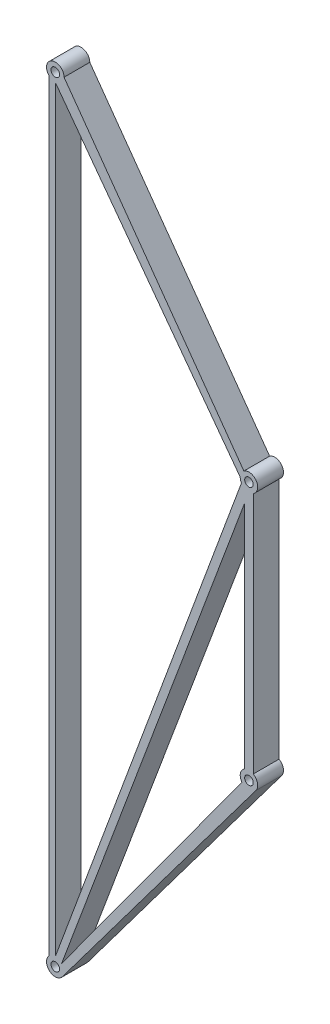
ISO-10303-21;
HEADER;
FILE_DESCRIPTION(('STEP AP214'),'2;1');
FILE_NAME('part.step','',(''),(''),'','','');
FILE_SCHEMA(('AUTOMOTIVE_DESIGN { 1 0 10303 214 1 1 1 1 }'));
ENDSEC;
DATA;
#1=APPLICATION_CONTEXT('core data for automotive mechanical design processes');
#2=APPLICATION_PROTOCOL_DEFINITION('international standard','automotive_design',2000,#1);
#3=PRODUCT_CONTEXT('',#1,'mechanical');
#4=PRODUCT('Part','Part','',(#3));
#5=PRODUCT_RELATED_PRODUCT_CATEGORY('part','',(#4));
#6=PRODUCT_DEFINITION_FORMATION('','',#4);
#7=PRODUCT_DEFINITION_CONTEXT('part definition',#1,'design');
#8=PRODUCT_DEFINITION('design','',#6,#7);
#9=PRODUCT_DEFINITION_SHAPE('','',#8);
#10=(LENGTH_UNIT() NAMED_UNIT(*) SI_UNIT(.MILLI.,.METRE.));
#11=(NAMED_UNIT(*) PLANE_ANGLE_UNIT() SI_UNIT($,.RADIAN.));
#12=(NAMED_UNIT(*) SI_UNIT($,.STERADIAN.) SOLID_ANGLE_UNIT());
#13=UNCERTAINTY_MEASURE_WITH_UNIT(LENGTH_MEASURE(1.E-05),#10,'distance_accuracy_value','');
#14=(GEOMETRIC_REPRESENTATION_CONTEXT(3) GLOBAL_UNCERTAINTY_ASSIGNED_CONTEXT((#13)) GLOBAL_UNIT_ASSIGNED_CONTEXT((#10,
#11,#12)) REPRESENTATION_CONTEXT('',''));
#15=CARTESIAN_POINT('',(0.,0.,0.));
#16=DIRECTION('',(0.,0.,1.));
#17=DIRECTION('',(1.,0.,0.));
#18=AXIS2_PLACEMENT_3D('',#15,#16,#17);
#19=CARTESIAN_POINT('',(0.,400.,39.9));
#20=DIRECTION('',(0.,0.,1.));
#21=DIRECTION('',(1.,0.,0.));
#22=AXIS2_PLACEMENT_3D('',#19,#20,#21);
#23=PLANE('',#22);
#24=CARTESIAN_POINT('',(0.,400.,39.9));
#25=DIRECTION('',(0.,0.,1.));
#26=DIRECTION('',(1.,0.,0.));
#27=AXIS2_PLACEMENT_3D('',#24,#25,#26);
#28=CIRCLE('',#27,6.64999999999998);
#29=CARTESIAN_POINT('',(6.64999999999998,400.,39.9));
#30=VERTEX_POINT('',#29);
#31=EDGE_CURVE('E183',#30,#30,#28,.T.);
#32=ORIENTED_EDGE('',*,*,#31,.F.);
#33=EDGE_LOOP('',(#32));
#34=FACE_BOUND('',#33,.T.);
#35=CARTESIAN_POINT('',(0.,0.,39.9));
#36=DIRECTION('',(0.,0.,1.));
#37=DIRECTION('',(1.,0.,0.));
#38=AXIS2_PLACEMENT_3D('',#35,#36,#37);
#39=CIRCLE('',#38,6.65);
#40=CARTESIAN_POINT('',(6.65,0.,39.9));
#41=VERTEX_POINT('',#40);
#42=EDGE_CURVE('E229',#41,#41,#39,.T.);
#43=ORIENTED_EDGE('',*,*,#42,.F.);
#44=EDGE_LOOP('',(#43));
#45=FACE_BOUND('',#44,.T.);
#46=CARTESIAN_POINT('',(0.,400.,39.9));
#47=DIRECTION('',(0.,0.,1.));
#48=DIRECTION('',(1.,0.,0.));
#49=AXIS2_PLACEMENT_3D('',#46,#47,#48);
#50=CIRCLE('',#49,13.55);
#51=CARTESIAN_POINT('',(6.68007705825914,388.211061519555,39.9));
#52=VERTEX_POINT('',#51);
#53=CARTESIAN_POINT('',(-7.88918874496178,411.01649676378,39.9));
#54=VERTEX_POINT('',#53);
#55=EDGE_CURVE('E237',#52,#54,#50,.T.);
#56=ORIENTED_EDGE('',*,*,#55,.T.);
#57=DIRECTION('',(-0.582227951657693,0.813025591422857,0.));
#58=VECTOR('',#57,1.);
#59=CARTESIAN_POINT('',(-286.45,800.,39.9));
#60=LINE('',#59,#58);
#61=CARTESIAN_POINT('',(-286.45,800.,39.9));
#62=VERTEX_POINT('',#61);
#63=EDGE_CURVE('E236',#54,#62,#60,.T.);
#64=ORIENTED_EDGE('',*,*,#63,.T.);
#65=CARTESIAN_POINT('',(-300.,800.,39.9));
#66=DIRECTION('',(0.,0.,1.));
#67=DIRECTION('',(1.,0.,0.));
#68=AXIS2_PLACEMENT_3D('',#65,#66,#67);
#69=CIRCLE('',#68,13.5500000000001);
#70=CARTESIAN_POINT('',(-309.83738553197,790.681827116039,39.9));
#71=VERTEX_POINT('',#70);
#72=EDGE_CURVE('E242',#62,#71,#69,.T.);
#73=ORIENTED_EDGE('',*,*,#72,.T.);
#74=DIRECTION('',(0.,-1.,0.));
#75=VECTOR('',#74,1.);
#76=CARTESIAN_POINT('',(-309.83738553197,-390.681827116039,39.9));
#77=LINE('',#76,#75);
#78=CARTESIAN_POINT('',(-309.83738553197,-390.681827116039,39.9));
#79=VERTEX_POINT('',#78);
#80=EDGE_CURVE('E243',#71,#79,#77,.T.);
#81=ORIENTED_EDGE('',*,*,#80,.T.);
#82=CARTESIAN_POINT('',(-300.,-400.,39.9));
#83=DIRECTION('',(0.,0.,1.));
#84=DIRECTION('',(1.,0.,0.));
#85=AXIS2_PLACEMENT_3D('',#82,#83,#84);
#86=CIRCLE('',#85,13.55);
#87=CARTESIAN_POINT('',(-289.16,-408.13,39.9));
#88=VERTEX_POINT('',#87);
#89=EDGE_CURVE('E247',#79,#88,#86,.T.);
#90=ORIENTED_EDGE('',*,*,#89,.T.);
#91=DIRECTION('',(0.6,0.8,0.));
#92=VECTOR('',#91,1.);
#93=CARTESIAN_POINT('',(-289.16,-408.13,39.9));
#94=LINE('',#93,#92);
#95=CARTESIAN_POINT('',(10.84,-8.13000000000002,39.9));
#96=VERTEX_POINT('',#95);
#97=EDGE_CURVE('E246',#88,#96,#94,.T.);
#98=ORIENTED_EDGE('',*,*,#97,.T.);
#99=CARTESIAN_POINT('',(0.,0.,39.9));
#100=DIRECTION('',(0.,0.,1.));
#101=DIRECTION('',(1.,0.,0.));
#102=AXIS2_PLACEMENT_3D('',#99,#100,#101);
#103=CIRCLE('',#102,13.55);
#104=CARTESIAN_POINT('',(6.6800770582592,11.7889384804451,39.9));
#105=VERTEX_POINT('',#104);
#106=EDGE_CURVE('E248',#96,#105,#103,.T.);
#107=ORIENTED_EDGE('',*,*,#106,.T.);
#108=DIRECTION('',(0.,1.,0.));
#109=VECTOR('',#108,1.);
#110=CARTESIAN_POINT('',(6.6800770582592,11.7889384804451,39.9));
#111=LINE('',#110,#109);
#112=EDGE_CURVE('E252',#105,#52,#111,.T.);
#113=ORIENTED_EDGE('',*,*,#112,.T.);
#114=EDGE_LOOP('',(#56,#64,#73,#81,#90,#98,#107,#113));
#115=FACE_BOUND('',#114,.T.);
#116=CARTESIAN_POINT('',(-300.,-400.,39.9));
#117=DIRECTION('',(0.,0.,1.));
#118=DIRECTION('',(1.,0.,0.));
#119=AXIS2_PLACEMENT_3D('',#116,#117,#118);
#120=CIRCLE('',#119,6.64999999999998);
#121=CARTESIAN_POINT('',(-293.35,-400.,39.9));
#122=VERTEX_POINT('',#121);
#123=EDGE_CURVE('E222',#122,#122,#120,.T.);
#124=ORIENTED_EDGE('',*,*,#123,.F.);
#125=EDGE_LOOP('',(#124));
#126=FACE_BOUND('',#125,.T.);
#127=DIRECTION('',(-0.349789502371966,-0.936828321535153,0.));
#128=VECTOR('',#127,1.);
#129=CARTESIAN_POINT('',(-290.16261446803,-390.681827116039,39.9));
#130=LINE('',#129,#128);
#131=CARTESIAN_POINT('',(-6.68007705825919,368.558996022529,39.9));
#132=VERTEX_POINT('',#131);
#133=CARTESIAN_POINT('',(-290.16261446803,-390.681827116039,39.9));
#134=VERTEX_POINT('',#133);
#135=EDGE_CURVE('E193',#132,#134,#130,.T.);
#136=ORIENTED_EDGE('',*,*,#135,.F.);
#137=DIRECTION('',(0.,1.,0.));
#138=VECTOR('',#137,1.);
#139=CARTESIAN_POINT('',(-6.6800770582592,11.7889384804451,39.9));
#140=LINE('',#139,#138);
#141=CARTESIAN_POINT('',(-6.68007705825919,11.7889384804451,39.9));
#142=VERTEX_POINT('',#141);
#143=EDGE_CURVE('E194',#142,#132,#140,.T.);
#144=ORIENTED_EDGE('',*,*,#143,.F.);
#145=CARTESIAN_POINT('',(0.,0.,39.9));
#146=DIRECTION('',(0.,0.,-1.));
#147=DIRECTION('',(1.,0.,0.));
#148=AXIS2_PLACEMENT_3D('',#145,#146,#147);
#149=CIRCLE('',#148,13.55);
#150=CARTESIAN_POINT('',(-10.84,-8.13000000000002,39.9));
#151=VERTEX_POINT('',#150);
#152=EDGE_CURVE('E202',#151,#142,#149,.T.);
#153=ORIENTED_EDGE('',*,*,#152,.F.);
#154=DIRECTION('',(0.589693832018984,0.807626884445266,0.));
#155=VECTOR('',#154,1.);
#156=CARTESIAN_POINT('',(-10.84,-8.13000000000002,39.9));
#157=LINE('',#156,#155);
#158=EDGE_CURVE('E199',#134,#151,#157,.T.);
#159=ORIENTED_EDGE('',*,*,#158,.F.);
#160=EDGE_LOOP('',(#136,#144,#153,#159));
#161=FACE_BOUND('',#160,.T.);
#162=DIRECTION('',(0.34696912121122,0.937876553137946,0.));
#163=VECTOR('',#162,1.);
#164=CARTESIAN_POINT('',(-300.,-386.45,39.9));
#165=LINE('',#164,#163);
#166=CARTESIAN_POINT('',(-300.,-386.45,39.9));
#167=VERTEX_POINT('',#166);
#168=CARTESIAN_POINT('',(-11.6261177350026,393.040410471022,39.9));
#169=VERTEX_POINT('',#168);
#170=EDGE_CURVE('E162',#167,#169,#165,.T.);
#171=ORIENTED_EDGE('',*,*,#170,.F.);
#172=DIRECTION('',(0.,-1.,0.));
#173=VECTOR('',#172,1.);
#174=CARTESIAN_POINT('',(-300.,-386.45,39.9));
#175=LINE('',#174,#173);
#176=CARTESIAN_POINT('',(-300.,786.45,39.9));
#177=VERTEX_POINT('',#176);
#178=EDGE_CURVE('E153',#177,#167,#175,.T.);
#179=ORIENTED_EDGE('',*,*,#178,.F.);
#180=DIRECTION('',(-0.595483554620882,0.803367497585058,0.));
#181=VECTOR('',#180,1.);
#182=CARTESIAN_POINT('',(-13.55,400.,39.9));
#183=LINE('',#182,#181);
#184=CARTESIAN_POINT('',(-13.55,400.,39.9));
#185=VERTEX_POINT('',#184);
#186=EDGE_CURVE('E180',#185,#177,#183,.T.);
#187=ORIENTED_EDGE('',*,*,#186,.F.);
#188=CARTESIAN_POINT('',(0.,400.,39.9));
#189=DIRECTION('',(0.,0.,-1.));
#190=DIRECTION('',(1.,0.,0.));
#191=AXIS2_PLACEMENT_3D('',#188,#189,#190);
#192=CIRCLE('',#191,13.55);
#193=EDGE_CURVE('E172',#169,#185,#192,.T.);
#194=ORIENTED_EDGE('',*,*,#193,.F.);
#195=EDGE_LOOP('',(#171,#179,#187,#194));
#196=FACE_BOUND('',#195,.T.);
#197=CARTESIAN_POINT('',(-300.,800.,39.9));
#198=DIRECTION('',(0.,0.,1.));
#199=DIRECTION('',(1.,0.,0.));
#200=AXIS2_PLACEMENT_3D('',#197,#198,#199);
#201=CIRCLE('',#200,6.65000000000009);
#202=CARTESIAN_POINT('',(-293.35,800.,39.9));
#203=VERTEX_POINT('',#202);
#204=EDGE_CURVE('E377',#203,#203,#201,.T.);
#205=ORIENTED_EDGE('',*,*,#204,.F.);
#206=EDGE_LOOP('',(#205));
#207=FACE_BOUND('',#206,.T.);
#208=ADVANCED_FACE('F41',(#34,#45,#115,#126,#161,#196,#207),#23,.T.);
#209=CARTESIAN_POINT('',(0.,400.,0.));
#210=DIRECTION('',(0.,0.,1.));
#211=DIRECTION('',(1.,0.,0.));
#212=AXIS2_PLACEMENT_3D('',#209,#210,#211);
#213=PLANE('',#212);
#214=DIRECTION('',(0.,1.,0.));
#215=VECTOR('',#214,1.);
#216=CARTESIAN_POINT('',(-6.6800770582592,11.7889384804451,0.));
#217=LINE('',#216,#215);
#218=CARTESIAN_POINT('',(-6.68007705825919,11.7889384804451,0.));
#219=VERTEX_POINT('',#218);
#220=CARTESIAN_POINT('',(-6.68007705825919,368.558996022529,0.));
#221=VERTEX_POINT('',#220);
#222=EDGE_CURVE('E169',#219,#221,#217,.T.);
#223=ORIENTED_EDGE('',*,*,#222,.T.);
#224=DIRECTION('',(-0.349789502371966,-0.936828321535153,0.));
#225=VECTOR('',#224,1.);
#226=CARTESIAN_POINT('',(-290.16261446803,-390.681827116039,0.));
#227=LINE('',#226,#225);
#228=CARTESIAN_POINT('',(-290.16261446803,-390.681827116039,0.));
#229=VERTEX_POINT('',#228);
#230=EDGE_CURVE('E206',#221,#229,#227,.T.);
#231=ORIENTED_EDGE('',*,*,#230,.T.);
#232=DIRECTION('',(0.589693832018984,0.807626884445266,0.));
#233=VECTOR('',#232,1.);
#234=CARTESIAN_POINT('',(-10.84,-8.13000000000002,0.));
#235=LINE('',#234,#233);
#236=CARTESIAN_POINT('',(-10.84,-8.13000000000002,0.));
#237=VERTEX_POINT('',#236);
#238=EDGE_CURVE('E208',#229,#237,#235,.T.);
#239=ORIENTED_EDGE('',*,*,#238,.T.);
#240=CARTESIAN_POINT('',(0.,0.,0.));
#241=DIRECTION('',(0.,0.,-1.));
#242=DIRECTION('',(1.,0.,0.));
#243=AXIS2_PLACEMENT_3D('',#240,#241,#242);
#244=CIRCLE('',#243,13.55);
#245=EDGE_CURVE('E196',#237,#219,#244,.T.);
#246=ORIENTED_EDGE('',*,*,#245,.T.);
#247=EDGE_LOOP('',(#223,#231,#239,#246));
#248=FACE_BOUND('',#247,.T.);
#249=CARTESIAN_POINT('',(0.,400.,0.));
#250=DIRECTION('',(0.,0.,1.));
#251=DIRECTION('',(1.,0.,0.));
#252=AXIS2_PLACEMENT_3D('',#249,#250,#251);
#253=CIRCLE('',#252,13.55);
#254=CARTESIAN_POINT('',(6.68007705825914,388.211061519555,0.));
#255=VERTEX_POINT('',#254);
#256=CARTESIAN_POINT('',(-7.88918874496178,411.01649676378,0.));
#257=VERTEX_POINT('',#256);
#258=EDGE_CURVE('E232',#255,#257,#253,.T.);
#259=ORIENTED_EDGE('',*,*,#258,.F.);
#260=DIRECTION('',(0.,1.,0.));
#261=VECTOR('',#260,1.);
#262=CARTESIAN_POINT('',(6.6800770582592,11.7889384804451,0.));
#263=LINE('',#262,#261);
#264=CARTESIAN_POINT('',(6.6800770582592,11.7889384804451,0.));
#265=VERTEX_POINT('',#264);
#266=EDGE_CURVE('E238',#265,#255,#263,.T.);
#267=ORIENTED_EDGE('',*,*,#266,.F.);
#268=CARTESIAN_POINT('',(0.,0.,0.));
#269=DIRECTION('',(0.,0.,1.));
#270=DIRECTION('',(1.,0.,0.));
#271=AXIS2_PLACEMENT_3D('',#268,#269,#270);
#272=CIRCLE('',#271,13.55);
#273=CARTESIAN_POINT('',(10.84,-8.13000000000002,0.));
#274=VERTEX_POINT('',#273);
#275=EDGE_CURVE('E270',#274,#265,#272,.T.);
#276=ORIENTED_EDGE('',*,*,#275,.F.);
#277=DIRECTION('',(0.6,0.8,0.));
#278=VECTOR('',#277,1.);
#279=CARTESIAN_POINT('',(-289.16,-408.13,0.));
#280=LINE('',#279,#278);
#281=CARTESIAN_POINT('',(-289.16,-408.13,0.));
#282=VERTEX_POINT('',#281);
#283=EDGE_CURVE('E262',#282,#274,#280,.T.);
#284=ORIENTED_EDGE('',*,*,#283,.F.);
#285=CARTESIAN_POINT('',(-300.,-400.,0.));
#286=DIRECTION('',(0.,0.,1.));
#287=DIRECTION('',(1.,0.,0.));
#288=AXIS2_PLACEMENT_3D('',#285,#286,#287);
#289=CIRCLE('',#288,13.55);
#290=CARTESIAN_POINT('',(-309.83738553197,-390.681827116039,0.));
#291=VERTEX_POINT('',#290);
#292=EDGE_CURVE('E261',#291,#282,#289,.T.);
#293=ORIENTED_EDGE('',*,*,#292,.F.);
#294=DIRECTION('',(0.,-1.,0.));
#295=VECTOR('',#294,1.);
#296=CARTESIAN_POINT('',(-309.83738553197,-390.681827116039,0.));
#297=LINE('',#296,#295);
#298=CARTESIAN_POINT('',(-309.83738553197,790.681827116039,0.));
#299=VERTEX_POINT('',#298);
#300=EDGE_CURVE('E263',#299,#291,#297,.T.);
#301=ORIENTED_EDGE('',*,*,#300,.F.);
#302=CARTESIAN_POINT('',(-300.,800.,0.));
#303=DIRECTION('',(0.,0.,1.));
#304=DIRECTION('',(1.,0.,0.));
#305=AXIS2_PLACEMENT_3D('',#302,#303,#304);
#306=CIRCLE('',#305,13.5500000000001);
#307=CARTESIAN_POINT('',(-286.45,800.,0.));
#308=VERTEX_POINT('',#307);
#309=EDGE_CURVE('E260',#308,#299,#306,.T.);
#310=ORIENTED_EDGE('',*,*,#309,.F.);
#311=DIRECTION('',(-0.582227951657693,0.813025591422857,0.));
#312=VECTOR('',#311,1.);
#313=CARTESIAN_POINT('',(-286.45,800.,0.));
#314=LINE('',#313,#312);
#315=EDGE_CURVE('E257',#257,#308,#314,.T.);
#316=ORIENTED_EDGE('',*,*,#315,.F.);
#317=EDGE_LOOP('',(#259,#267,#276,#284,#293,#301,#310,#316));
#318=FACE_BOUND('',#317,.T.);
#319=CARTESIAN_POINT('',(0.,0.,0.));
#320=DIRECTION('',(0.,0.,1.));
#321=DIRECTION('',(1.,0.,0.));
#322=AXIS2_PLACEMENT_3D('',#319,#320,#321);
#323=CIRCLE('',#322,6.65);
#324=CARTESIAN_POINT('',(6.65,0.,0.));
#325=VERTEX_POINT('',#324);
#326=EDGE_CURVE('E230',#325,#325,#323,.T.);
#327=ORIENTED_EDGE('',*,*,#326,.T.);
#328=EDGE_LOOP('',(#327));
#329=FACE_BOUND('',#328,.T.);
#330=CARTESIAN_POINT('',(-300.,-400.,0.));
#331=DIRECTION('',(0.,0.,1.));
#332=DIRECTION('',(1.,0.,0.));
#333=AXIS2_PLACEMENT_3D('',#330,#331,#332);
#334=CIRCLE('',#333,6.64999999999998);
#335=CARTESIAN_POINT('',(-293.35,-400.,0.));
#336=VERTEX_POINT('',#335);
#337=EDGE_CURVE('E223',#336,#336,#334,.T.);
#338=ORIENTED_EDGE('',*,*,#337,.T.);
#339=EDGE_LOOP('',(#338));
#340=FACE_BOUND('',#339,.T.);
#341=DIRECTION('',(0.,-1.,0.));
#342=VECTOR('',#341,1.);
#343=CARTESIAN_POINT('',(-300.,-386.45,0.));
#344=LINE('',#343,#342);
#345=CARTESIAN_POINT('',(-300.,786.45,0.));
#346=VERTEX_POINT('',#345);
#347=CARTESIAN_POINT('',(-300.,-386.45,0.));
#348=VERTEX_POINT('',#347);
#349=EDGE_CURVE('E63',#346,#348,#344,.T.);
#350=ORIENTED_EDGE('',*,*,#349,.T.);
#351=DIRECTION('',(0.34696912121122,0.937876553137946,0.));
#352=VECTOR('',#351,1.);
#353=CARTESIAN_POINT('',(-300.,-386.45,0.));
#354=LINE('',#353,#352);
#355=CARTESIAN_POINT('',(-11.6261177350026,393.040410471022,0.));
#356=VERTEX_POINT('',#355);
#357=EDGE_CURVE('E170',#348,#356,#354,.T.);
#358=ORIENTED_EDGE('',*,*,#357,.T.);
#359=CARTESIAN_POINT('',(0.,400.,0.));
#360=DIRECTION('',(0.,0.,-1.));
#361=DIRECTION('',(1.,0.,0.));
#362=AXIS2_PLACEMENT_3D('',#359,#360,#361);
#363=CIRCLE('',#362,13.55);
#364=CARTESIAN_POINT('',(-13.55,400.,0.));
#365=VERTEX_POINT('',#364);
#366=EDGE_CURVE('E184',#356,#365,#363,.T.);
#367=ORIENTED_EDGE('',*,*,#366,.T.);
#368=DIRECTION('',(-0.595483554620882,0.803367497585058,0.));
#369=VECTOR('',#368,1.);
#370=CARTESIAN_POINT('',(-13.55,400.,0.));
#371=LINE('',#370,#369);
#372=EDGE_CURVE('E164',#365,#346,#371,.T.);
#373=ORIENTED_EDGE('',*,*,#372,.T.);
#374=EDGE_LOOP('',(#350,#358,#367,#373));
#375=FACE_BOUND('',#374,.T.);
#376=CARTESIAN_POINT('',(0.,400.,0.));
#377=DIRECTION('',(0.,0.,1.));
#378=DIRECTION('',(1.,0.,0.));
#379=AXIS2_PLACEMENT_3D('',#376,#377,#378);
#380=CIRCLE('',#379,6.64999999999998);
#381=CARTESIAN_POINT('',(6.64999999999998,400.,0.));
#382=VERTEX_POINT('',#381);
#383=EDGE_CURVE('E375',#382,#382,#380,.T.);
#384=ORIENTED_EDGE('',*,*,#383,.T.);
#385=EDGE_LOOP('',(#384));
#386=FACE_BOUND('',#385,.T.);
#387=CARTESIAN_POINT('',(-300.,800.,0.));
#388=DIRECTION('',(0.,0.,1.));
#389=DIRECTION('',(1.,0.,0.));
#390=AXIS2_PLACEMENT_3D('',#387,#388,#389);
#391=CIRCLE('',#390,6.65000000000009);
#392=CARTESIAN_POINT('',(-293.35,800.,0.));
#393=VERTEX_POINT('',#392);
#394=EDGE_CURVE('E373',#393,#393,#391,.T.);
#395=ORIENTED_EDGE('',*,*,#394,.T.);
#396=EDGE_LOOP('',(#395));
#397=FACE_BOUND('',#396,.T.);
#398=ADVANCED_FACE('F297',(#248,#318,#329,#340,#375,#386,#397),#213,.F.);
#399=CARTESIAN_POINT('',(0.,400.,39.9));
#400=DIRECTION('',(0.,0.,-1.));
#401=DIRECTION('',(-1.,0.,0.));
#402=AXIS2_PLACEMENT_3D('',#399,#400,#401);
#403=CYLINDRICAL_SURFACE('',#402,13.55);
#404=ORIENTED_EDGE('',*,*,#258,.T.);
#405=DIRECTION('',(0.,0.,-1.));
#406=VECTOR('',#405,1.);
#407=CARTESIAN_POINT('',(-7.88918874496178,411.01649676378,39.9));
#408=LINE('',#407,#406);
#409=EDGE_CURVE('E11',#54,#257,#408,.T.);
#410=ORIENTED_EDGE('',*,*,#409,.F.);
#411=ORIENTED_EDGE('',*,*,#55,.F.);
#412=DIRECTION('',(0.,0.,-1.));
#413=VECTOR('',#412,1.);
#414=CARTESIAN_POINT('',(6.68007705825914,388.211061519555,39.9));
#415=LINE('',#414,#413);
#416=EDGE_CURVE('E253',#52,#255,#415,.T.);
#417=ORIENTED_EDGE('',*,*,#416,.T.);
#418=EDGE_LOOP('',(#404,#410,#411,#417));
#419=FACE_BOUND('',#418,.T.);
#420=ADVANCED_FACE('F43',(#419),#403,.T.);
#421=CARTESIAN_POINT('',(-286.45,800.,39.9));
#422=DIRECTION('',(-0.813025591422857,-0.582227951657693,0.));
#423=DIRECTION('',(0.582227951657693,-0.813025591422857,0.));
#424=AXIS2_PLACEMENT_3D('',#421,#422,#423);
#425=PLANE('',#424);
#426=ORIENTED_EDGE('',*,*,#315,.T.);
#427=DIRECTION('',(0.,0.,-1.));
#428=VECTOR('',#427,1.);
#429=CARTESIAN_POINT('',(-286.45,800.,39.9));
#430=LINE('',#429,#428);
#431=EDGE_CURVE('E47',#62,#308,#430,.T.);
#432=ORIENTED_EDGE('',*,*,#431,.F.);
#433=ORIENTED_EDGE('',*,*,#63,.F.);
#434=ORIENTED_EDGE('',*,*,#409,.T.);
#435=EDGE_LOOP('',(#426,#432,#433,#434));
#436=FACE_BOUND('',#435,.T.);
#437=ADVANCED_FACE('F314',(#436),#425,.F.);
#438=CARTESIAN_POINT('',(-300.,800.,39.9));
#439=DIRECTION('',(0.,0.,-1.));
#440=DIRECTION('',(-1.,0.,0.));
#441=AXIS2_PLACEMENT_3D('',#438,#439,#440);
#442=CYLINDRICAL_SURFACE('',#441,13.5500000000001);
#443=ORIENTED_EDGE('',*,*,#309,.T.);
#444=DIRECTION('',(0.,0.,-1.));
#445=VECTOR('',#444,1.);
#446=CARTESIAN_POINT('',(-309.83738553197,790.681827116039,39.9));
#447=LINE('',#446,#445);
#448=EDGE_CURVE('E281',#71,#299,#447,.T.);
#449=ORIENTED_EDGE('',*,*,#448,.F.);
#450=ORIENTED_EDGE('',*,*,#72,.F.);
#451=ORIENTED_EDGE('',*,*,#431,.T.);
#452=EDGE_LOOP('',(#443,#449,#450,#451));
#453=FACE_BOUND('',#452,.T.);
#454=ADVANCED_FACE('F292',(#453),#442,.T.);
#455=CARTESIAN_POINT('',(-309.83738553197,-390.681827116039,39.9));
#456=DIRECTION('',(1.,0.,0.));
#457=DIRECTION('',(0.,0.,-1.));
#458=AXIS2_PLACEMENT_3D('',#455,#456,#457);
#459=PLANE('',#458);
#460=ORIENTED_EDGE('',*,*,#300,.T.);
#461=DIRECTION('',(0.,0.,-1.));
#462=VECTOR('',#461,1.);
#463=CARTESIAN_POINT('',(-309.83738553197,-390.681827116039,39.9));
#464=LINE('',#463,#462);
#465=EDGE_CURVE('E282',#79,#291,#464,.T.);
#466=ORIENTED_EDGE('',*,*,#465,.F.);
#467=ORIENTED_EDGE('',*,*,#80,.F.);
#468=ORIENTED_EDGE('',*,*,#448,.T.);
#469=EDGE_LOOP('',(#460,#466,#467,#468));
#470=FACE_BOUND('',#469,.T.);
#471=ADVANCED_FACE('F301',(#470),#459,.F.);
#472=CARTESIAN_POINT('',(-300.,-400.,39.9));
#473=DIRECTION('',(0.,0.,-1.));
#474=DIRECTION('',(-1.,0.,0.));
#475=AXIS2_PLACEMENT_3D('',#472,#473,#474);
#476=CYLINDRICAL_SURFACE('',#475,13.55);
#477=ORIENTED_EDGE('',*,*,#292,.T.);
#478=DIRECTION('',(0.,0.,-1.));
#479=VECTOR('',#478,1.);
#480=CARTESIAN_POINT('',(-289.16,-408.13,39.9));
#481=LINE('',#480,#479);
#482=EDGE_CURVE('E277',#88,#282,#481,.T.);
#483=ORIENTED_EDGE('',*,*,#482,.F.);
#484=ORIENTED_EDGE('',*,*,#89,.F.);
#485=ORIENTED_EDGE('',*,*,#465,.T.);
#486=EDGE_LOOP('',(#477,#483,#484,#485));
#487=FACE_BOUND('',#486,.T.);
#488=ADVANCED_FACE('F310',(#487),#476,.T.);
#489=CARTESIAN_POINT('',(-289.16,-408.13,39.9));
#490=DIRECTION('',(-0.8,0.6,0.));
#491=DIRECTION('',(-0.6,-0.8,0.));
#492=AXIS2_PLACEMENT_3D('',#489,#490,#491);
#493=PLANE('',#492);
#494=ORIENTED_EDGE('',*,*,#283,.T.);
#495=DIRECTION('',(0.,0.,-1.));
#496=VECTOR('',#495,1.);
#497=CARTESIAN_POINT('',(10.84,-8.13000000000002,39.9));
#498=LINE('',#497,#496);
#499=EDGE_CURVE('E274',#96,#274,#498,.T.);
#500=ORIENTED_EDGE('',*,*,#499,.F.);
#501=ORIENTED_EDGE('',*,*,#97,.F.);
#502=ORIENTED_EDGE('',*,*,#482,.T.);
#503=EDGE_LOOP('',(#494,#500,#501,#502));
#504=FACE_BOUND('',#503,.T.);
#505=ADVANCED_FACE('F329',(#504),#493,.F.);
#506=CARTESIAN_POINT('',(0.,0.,39.9));
#507=DIRECTION('',(0.,0.,-1.));
#508=DIRECTION('',(-1.,0.,0.));
#509=AXIS2_PLACEMENT_3D('',#506,#507,#508);
#510=CYLINDRICAL_SURFACE('',#509,13.55);
#511=ORIENTED_EDGE('',*,*,#275,.T.);
#512=DIRECTION('',(0.,0.,-1.));
#513=VECTOR('',#512,1.);
#514=CARTESIAN_POINT('',(6.6800770582592,11.7889384804451,39.9));
#515=LINE('',#514,#513);
#516=EDGE_CURVE('E275',#105,#265,#515,.T.);
#517=ORIENTED_EDGE('',*,*,#516,.F.);
#518=ORIENTED_EDGE('',*,*,#106,.F.);
#519=ORIENTED_EDGE('',*,*,#499,.T.);
#520=EDGE_LOOP('',(#511,#517,#518,#519));
#521=FACE_BOUND('',#520,.T.);
#522=ADVANCED_FACE('F327',(#521),#510,.T.);
#523=CARTESIAN_POINT('',(6.6800770582592,11.7889384804451,39.9));
#524=DIRECTION('',(-1.,0.,0.));
#525=DIRECTION('',(0.,-1.,0.));
#526=AXIS2_PLACEMENT_3D('',#523,#524,#525);
#527=PLANE('',#526);
#528=ORIENTED_EDGE('',*,*,#266,.T.);
#529=ORIENTED_EDGE('',*,*,#416,.F.);
#530=ORIENTED_EDGE('',*,*,#112,.F.);
#531=ORIENTED_EDGE('',*,*,#516,.T.);
#532=EDGE_LOOP('',(#528,#529,#530,#531));
#533=FACE_BOUND('',#532,.T.);
#534=ADVANCED_FACE('F321',(#533),#527,.F.);
#535=CARTESIAN_POINT('',(0.,0.,39.9));
#536=DIRECTION('',(0.,0.,-1.));
#537=DIRECTION('',(-1.,0.,0.));
#538=AXIS2_PLACEMENT_3D('',#535,#536,#537);
#539=CYLINDRICAL_SURFACE('',#538,6.65);
#540=ORIENTED_EDGE('',*,*,#42,.T.);
#541=EDGE_LOOP('',(#540));
#542=FACE_BOUND('',#541,.T.);
#543=ORIENTED_EDGE('',*,*,#326,.F.);
#544=EDGE_LOOP('',(#543));
#545=FACE_BOUND('',#544,.T.);
#546=ADVANCED_FACE('F346',(#542,#545),#539,.F.);
#547=CARTESIAN_POINT('',(-300.,-400.,39.9));
#548=DIRECTION('',(0.,0.,-1.));
#549=DIRECTION('',(-1.,0.,0.));
#550=AXIS2_PLACEMENT_3D('',#547,#548,#549);
#551=CYLINDRICAL_SURFACE('',#550,6.64999999999998);
#552=ORIENTED_EDGE('',*,*,#123,.T.);
#553=EDGE_LOOP('',(#552));
#554=FACE_BOUND('',#553,.T.);
#555=ORIENTED_EDGE('',*,*,#337,.F.);
#556=EDGE_LOOP('',(#555));
#557=FACE_BOUND('',#556,.T.);
#558=ADVANCED_FACE('F352',(#554,#557),#551,.F.);
#559=CARTESIAN_POINT('',(-6.6800770582592,11.7889384804451,39.9));
#560=DIRECTION('',(-1.,0.,0.));
#561=DIRECTION('',(0.,-1.,0.));
#562=AXIS2_PLACEMENT_3D('',#559,#560,#561);
#563=PLANE('',#562);
#564=ORIENTED_EDGE('',*,*,#222,.F.);
#565=DIRECTION('',(0.,0.,-1.));
#566=VECTOR('',#565,1.);
#567=CARTESIAN_POINT('',(-6.68007705825919,11.7889384804451,39.9));
#568=LINE('',#567,#566);
#569=EDGE_CURVE('E201',#142,#219,#568,.T.);
#570=ORIENTED_EDGE('',*,*,#569,.F.);
#571=ORIENTED_EDGE('',*,*,#143,.T.);
#572=DIRECTION('',(0.,0.,-1.));
#573=VECTOR('',#572,1.);
#574=CARTESIAN_POINT('',(-6.68007705825919,368.558996022529,39.9));
#575=LINE('',#574,#573);
#576=EDGE_CURVE('E217',#132,#221,#575,.T.);
#577=ORIENTED_EDGE('',*,*,#576,.T.);
#578=EDGE_LOOP('',(#564,#570,#571,#577));
#579=FACE_BOUND('',#578,.T.);
#580=ADVANCED_FACE('F359',(#579),#563,.T.);
#581=CARTESIAN_POINT('',(-290.16261446803,-390.681827116039,39.9));
#582=DIRECTION('',(0.936828321535153,-0.349789502371966,0.));
#583=DIRECTION('',(0.349789502371966,0.936828321535153,0.));
#584=AXIS2_PLACEMENT_3D('',#581,#582,#583);
#585=PLANE('',#584);
#586=ORIENTED_EDGE('',*,*,#230,.F.);
#587=ORIENTED_EDGE('',*,*,#576,.F.);
#588=ORIENTED_EDGE('',*,*,#135,.T.);
#589=DIRECTION('',(0.,0.,-1.));
#590=VECTOR('',#589,1.);
#591=CARTESIAN_POINT('',(-290.16261446803,-390.681827116039,39.9));
#592=LINE('',#591,#590);
#593=EDGE_CURVE('E216',#134,#229,#592,.T.);
#594=ORIENTED_EDGE('',*,*,#593,.T.);
#595=EDGE_LOOP('',(#586,#587,#588,#594));
#596=FACE_BOUND('',#595,.T.);
#597=ADVANCED_FACE('F412',(#596),#585,.T.);
#598=CARTESIAN_POINT('',(-10.84,-8.13000000000002,39.9));
#599=DIRECTION('',(-0.807626884445266,0.589693832018984,0.));
#600=DIRECTION('',(-0.589693832018984,-0.807626884445266,0.));
#601=AXIS2_PLACEMENT_3D('',#598,#599,#600);
#602=PLANE('',#601);
#603=ORIENTED_EDGE('',*,*,#238,.F.);
#604=ORIENTED_EDGE('',*,*,#593,.F.);
#605=ORIENTED_EDGE('',*,*,#158,.T.);
#606=DIRECTION('',(0.,0.,-1.));
#607=VECTOR('',#606,1.);
#608=CARTESIAN_POINT('',(-10.84,-8.13000000000002,39.9));
#609=LINE('',#608,#607);
#610=EDGE_CURVE('E218',#151,#237,#609,.T.);
#611=ORIENTED_EDGE('',*,*,#610,.T.);
#612=EDGE_LOOP('',(#603,#604,#605,#611));
#613=FACE_BOUND('',#612,.T.);
#614=ADVANCED_FACE('F407',(#613),#602,.T.);
#615=CARTESIAN_POINT('',(0.,0.,39.9));
#616=DIRECTION('',(0.,0.,-1.));
#617=DIRECTION('',(-1.,0.,0.));
#618=AXIS2_PLACEMENT_3D('',#615,#616,#617);
#619=CYLINDRICAL_SURFACE('',#618,13.55);
#620=ORIENTED_EDGE('',*,*,#245,.F.);
#621=ORIENTED_EDGE('',*,*,#610,.F.);
#622=ORIENTED_EDGE('',*,*,#152,.T.);
#623=ORIENTED_EDGE('',*,*,#569,.T.);
#624=EDGE_LOOP('',(#620,#621,#622,#623));
#625=FACE_BOUND('',#624,.T.);
#626=ADVANCED_FACE('F406',(#625),#619,.T.);
#627=CARTESIAN_POINT('',(-300.,-386.45,39.9));
#628=DIRECTION('',(1.,0.,0.));
#629=DIRECTION('',(0.,0.,-1.));
#630=AXIS2_PLACEMENT_3D('',#627,#628,#629);
#631=PLANE('',#630);
#632=ORIENTED_EDGE('',*,*,#349,.F.);
#633=DIRECTION('',(0.,0.,-1.));
#634=VECTOR('',#633,1.);
#635=CARTESIAN_POINT('',(-300.,786.45,39.9));
#636=LINE('',#635,#634);
#637=EDGE_CURVE('E156',#177,#346,#636,.T.);
#638=ORIENTED_EDGE('',*,*,#637,.F.);
#639=ORIENTED_EDGE('',*,*,#178,.T.);
#640=DIRECTION('',(0.,0.,-1.));
#641=VECTOR('',#640,1.);
#642=CARTESIAN_POINT('',(-300.,-386.45,39.9));
#643=LINE('',#642,#641);
#644=EDGE_CURVE('E160',#167,#348,#643,.T.);
#645=ORIENTED_EDGE('',*,*,#644,.T.);
#646=EDGE_LOOP('',(#632,#638,#639,#645));
#647=FACE_BOUND('',#646,.T.);
#648=ADVANCED_FACE('F157',(#647),#631,.T.);
#649=CARTESIAN_POINT('',(-300.,-386.45,39.9));
#650=DIRECTION('',(-0.937876553137946,0.34696912121122,0.));
#651=DIRECTION('',(-0.34696912121122,-0.937876553137946,0.));
#652=AXIS2_PLACEMENT_3D('',#649,#650,#651);
#653=PLANE('',#652);
#654=ORIENTED_EDGE('',*,*,#357,.F.);
#655=ORIENTED_EDGE('',*,*,#644,.F.);
#656=ORIENTED_EDGE('',*,*,#170,.T.);
#657=DIRECTION('',(0.,0.,-1.));
#658=VECTOR('',#657,1.);
#659=CARTESIAN_POINT('',(-11.6261177350026,393.040410471022,39.9));
#660=LINE('',#659,#658);
#661=EDGE_CURVE('E173',#169,#356,#660,.T.);
#662=ORIENTED_EDGE('',*,*,#661,.T.);
#663=EDGE_LOOP('',(#654,#655,#656,#662));
#664=FACE_BOUND('',#663,.T.);
#665=ADVANCED_FACE('F168',(#664),#653,.T.);
#666=CARTESIAN_POINT('',(0.,400.,39.9));
#667=DIRECTION('',(0.,0.,-1.));
#668=DIRECTION('',(-1.,0.,0.));
#669=AXIS2_PLACEMENT_3D('',#666,#667,#668);
#670=CYLINDRICAL_SURFACE('',#669,13.55);
#671=ORIENTED_EDGE('',*,*,#366,.F.);
#672=ORIENTED_EDGE('',*,*,#661,.F.);
#673=ORIENTED_EDGE('',*,*,#193,.T.);
#674=DIRECTION('',(0.,0.,-1.));
#675=VECTOR('',#674,1.);
#676=CARTESIAN_POINT('',(-13.55,400.,39.9));
#677=LINE('',#676,#675);
#678=EDGE_CURVE('E57',#185,#365,#677,.T.);
#679=ORIENTED_EDGE('',*,*,#678,.T.);
#680=EDGE_LOOP('',(#671,#672,#673,#679));
#681=FACE_BOUND('',#680,.T.);
#682=ADVANCED_FACE('F398',(#681),#670,.T.);
#683=CARTESIAN_POINT('',(-13.55,400.,39.9));
#684=DIRECTION('',(-0.803367497585058,-0.595483554620882,0.));
#685=DIRECTION('',(0.595483554620882,-0.803367497585058,0.));
#686=AXIS2_PLACEMENT_3D('',#683,#684,#685);
#687=PLANE('',#686);
#688=ORIENTED_EDGE('',*,*,#372,.F.);
#689=ORIENTED_EDGE('',*,*,#678,.F.);
#690=ORIENTED_EDGE('',*,*,#186,.T.);
#691=ORIENTED_EDGE('',*,*,#637,.T.);
#692=EDGE_LOOP('',(#688,#689,#690,#691));
#693=FACE_BOUND('',#692,.T.);
#694=ADVANCED_FACE('F389',(#693),#687,.T.);
#695=CARTESIAN_POINT('',(0.,400.,39.9));
#696=DIRECTION('',(0.,0.,-1.));
#697=DIRECTION('',(-1.,0.,0.));
#698=AXIS2_PLACEMENT_3D('',#695,#696,#697);
#699=CYLINDRICAL_SURFACE('',#698,6.64999999999998);
#700=ORIENTED_EDGE('',*,*,#31,.T.);
#701=EDGE_LOOP('',(#700));
#702=FACE_BOUND('',#701,.T.);
#703=ORIENTED_EDGE('',*,*,#383,.F.);
#704=EDGE_LOOP('',(#703));
#705=FACE_BOUND('',#704,.T.);
#706=ADVANCED_FACE('F384',(#702,#705),#699,.F.);
#707=CARTESIAN_POINT('',(-300.,800.,39.9));
#708=DIRECTION('',(0.,0.,-1.));
#709=DIRECTION('',(-1.,0.,0.));
#710=AXIS2_PLACEMENT_3D('',#707,#708,#709);
#711=CYLINDRICAL_SURFACE('',#710,6.65000000000009);
#712=ORIENTED_EDGE('',*,*,#204,.T.);
#713=EDGE_LOOP('',(#712));
#714=FACE_BOUND('',#713,.T.);
#715=ORIENTED_EDGE('',*,*,#394,.F.);
#716=EDGE_LOOP('',(#715));
#717=FACE_BOUND('',#716,.T.);
#718=ADVANCED_FACE('F387',(#714,#717),#711,.F.);
#719=CLOSED_SHELL('',(#208,#398,#420,#437,#454,#471,#488,#505,#522,#534,#546,#558,#580,#597,
#614,#626,#648,#665,#682,#694,#706,#718));
#720=MANIFOLD_SOLID_BREP('B2',#719);
#721=ADVANCED_BREP_SHAPE_REPRESENTATION('',(#18,#720),#14);
#722=SHAPE_DEFINITION_REPRESENTATION(#9,#721);
ENDSEC;
END-ISO-10303-21;
